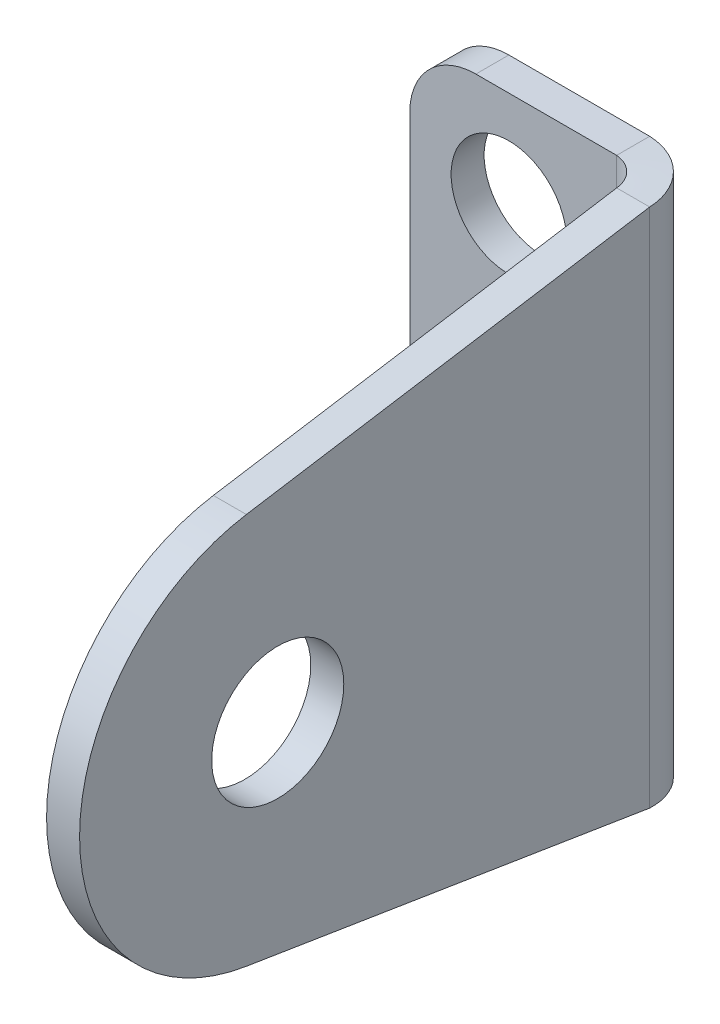
ISO-10303-21;
HEADER;
FILE_DESCRIPTION(('STEP AP214'),'2;1');
FILE_NAME('part.step','',(''),(''),'','','');
FILE_SCHEMA(('AUTOMOTIVE_DESIGN { 1 0 10303 214 1 1 1 1 }'));
ENDSEC;
DATA;
#1=APPLICATION_CONTEXT('core data for automotive mechanical design processes');
#2=APPLICATION_PROTOCOL_DEFINITION('international standard','automotive_design',2000,#1);
#3=PRODUCT_CONTEXT('',#1,'mechanical');
#4=PRODUCT('Part','Part','',(#3));
#5=PRODUCT_RELATED_PRODUCT_CATEGORY('part','',(#4));
#6=PRODUCT_DEFINITION_FORMATION('','',#4);
#7=PRODUCT_DEFINITION_CONTEXT('part definition',#1,'design');
#8=PRODUCT_DEFINITION('design','',#6,#7);
#9=PRODUCT_DEFINITION_SHAPE('','',#8);
#10=(LENGTH_UNIT() NAMED_UNIT(*) SI_UNIT(.MILLI.,.METRE.));
#11=(NAMED_UNIT(*) PLANE_ANGLE_UNIT() SI_UNIT($,.RADIAN.));
#12=(NAMED_UNIT(*) SI_UNIT($,.STERADIAN.) SOLID_ANGLE_UNIT());
#13=UNCERTAINTY_MEASURE_WITH_UNIT(LENGTH_MEASURE(1.E-05),#10,'distance_accuracy_value','');
#14=(GEOMETRIC_REPRESENTATION_CONTEXT(3) GLOBAL_UNCERTAINTY_ASSIGNED_CONTEXT((#13)) GLOBAL_UNIT_ASSIGNED_CONTEXT((#10,
#11,#12)) REPRESENTATION_CONTEXT('',''));
#15=CARTESIAN_POINT('',(0.,0.,0.));
#16=DIRECTION('',(0.,0.,1.));
#17=DIRECTION('',(1.,0.,0.));
#18=AXIS2_PLACEMENT_3D('',#15,#16,#17);
#19=CARTESIAN_POINT('',(0.,16.,-1.));
#20=DIRECTION('',(0.,1.,0.));
#21=DIRECTION('',(0.,0.,1.));
#22=AXIS2_PLACEMENT_3D('',#19,#20,#21);
#23=PLANE('',#22);
#24=DIRECTION('',(-1.,0.,0.));
#25=VECTOR('',#24,1.);
#26=CARTESIAN_POINT('',(0.,16.,-1.));
#27=LINE('',#26,#25);
#28=CARTESIAN_POINT('',(0.26340000000001,16.,-0.999999999999999));
#29=VERTEX_POINT('',#28);
#30=CARTESIAN_POINT('',(-3.99999999999999,16.,-1.));
#31=VERTEX_POINT('',#30);
#32=EDGE_CURVE('E253',#29,#31,#27,.T.);
#33=ORIENTED_EDGE('',*,*,#32,.T.);
#34=DIRECTION('',(0.,0.,1.));
#35=VECTOR('',#34,1.);
#36=CARTESIAN_POINT('',(-3.99999999999999,16.,-1.));
#37=LINE('',#36,#35);
#38=CARTESIAN_POINT('',(-3.99999999999999,16.,0.));
#39=VERTEX_POINT('',#38);
#40=EDGE_CURVE('E13',#31,#39,#37,.T.);
#41=ORIENTED_EDGE('',*,*,#40,.T.);
#42=DIRECTION('',(-1.,0.,0.));
#43=VECTOR('',#42,1.);
#44=CARTESIAN_POINT('',(0.,16.,0.));
#45=LINE('',#44,#43);
#46=CARTESIAN_POINT('',(0.263400000000009,16.,0.));
#47=VERTEX_POINT('',#46);
#48=EDGE_CURVE('E248',#47,#39,#45,.T.);
#49=ORIENTED_EDGE('',*,*,#48,.F.);
#50=DIRECTION('',(0.,0.,-1.));
#51=VECTOR('',#50,1.);
#52=CARTESIAN_POINT('',(0.263400000000009,16.,0.));
#53=LINE('',#52,#51);
#54=EDGE_CURVE('E236',#47,#29,#53,.T.);
#55=ORIENTED_EDGE('',*,*,#54,.T.);
#56=EDGE_LOOP('',(#33,#41,#49,#55));
#57=FACE_BOUND('',#56,.T.);
#58=ADVANCED_FACE('F55',(#57),#23,.T.);
#59=CARTESIAN_POINT('',(0.,0.,-1.));
#60=DIRECTION('',(0.,0.,-1.));
#61=DIRECTION('',(-1.,0.,0.));
#62=AXIS2_PLACEMENT_3D('',#59,#60,#61);
#63=PLANE('',#62);
#64=CARTESIAN_POINT('',(-2.99999999999999,3.,-1.));
#65=DIRECTION('',(0.,0.,1.));
#66=DIRECTION('',(1.,0.,0.));
#67=AXIS2_PLACEMENT_3D('',#64,#65,#66);
#68=CIRCLE('',#67,1.75);
#69=CARTESIAN_POINT('',(-1.24999999999999,3.,-1.));
#70=VERTEX_POINT('',#69);
#71=EDGE_CURVE('E239',#70,#70,#68,.T.);
#72=ORIENTED_EDGE('',*,*,#71,.T.);
#73=EDGE_LOOP('',(#72));
#74=FACE_BOUND('',#73,.T.);
#75=CARTESIAN_POINT('',(-2.99999999999999,13.,-1.));
#76=DIRECTION('',(0.,0.,1.));
#77=DIRECTION('',(1.,0.,0.));
#78=AXIS2_PLACEMENT_3D('',#75,#76,#77);
#79=CIRCLE('',#78,1.75);
#80=CARTESIAN_POINT('',(-1.24999999999999,13.,-1.));
#81=VERTEX_POINT('',#80);
#82=EDGE_CURVE('E245',#81,#81,#79,.T.);
#83=ORIENTED_EDGE('',*,*,#82,.T.);
#84=EDGE_LOOP('',(#83));
#85=FACE_BOUND('',#84,.T.);
#86=DIRECTION('',(1.,0.,0.));
#87=VECTOR('',#86,1.);
#88=CARTESIAN_POINT('',(2.00000000000001,0.,-1.));
#89=LINE('',#88,#87);
#90=CARTESIAN_POINT('',(-3.99999999999999,0.,-1.));
#91=VERTEX_POINT('',#90);
#92=CARTESIAN_POINT('',(0.263400000000012,0.,-1.));
#93=VERTEX_POINT('',#92);
#94=EDGE_CURVE('E251',#91,#93,#89,.T.);
#95=ORIENTED_EDGE('',*,*,#94,.F.);
#96=CARTESIAN_POINT('',(-3.99999999999999,2.,-1.));
#97=DIRECTION('',(0.,0.,-1.));
#98=DIRECTION('',(-1.,0.,0.));
#99=AXIS2_PLACEMENT_3D('',#96,#97,#98);
#100=CIRCLE('',#99,2.);
#101=CARTESIAN_POINT('',(-5.99999999999999,2.,-1.));
#102=VERTEX_POINT('',#101);
#103=EDGE_CURVE('E63',#91,#102,#100,.T.);
#104=ORIENTED_EDGE('',*,*,#103,.T.);
#105=DIRECTION('',(0.,-1.,0.));
#106=VECTOR('',#105,1.);
#107=CARTESIAN_POINT('',(-5.99999999999999,0.,-1.));
#108=LINE('',#107,#106);
#109=CARTESIAN_POINT('',(-5.99999999999999,14.,-1.));
#110=VERTEX_POINT('',#109);
#111=EDGE_CURVE('E256',#110,#102,#108,.T.);
#112=ORIENTED_EDGE('',*,*,#111,.F.);
#113=CARTESIAN_POINT('',(-3.99999999999999,14.,-1.));
#114=DIRECTION('',(0.,0.,-1.));
#115=DIRECTION('',(-1.,0.,0.));
#116=AXIS2_PLACEMENT_3D('',#113,#114,#115);
#117=CIRCLE('',#116,2.);
#118=EDGE_CURVE('E70',#110,#31,#117,.T.);
#119=ORIENTED_EDGE('',*,*,#118,.T.);
#120=ORIENTED_EDGE('',*,*,#32,.F.);
#121=DIRECTION('',(0.,1.,0.));
#122=VECTOR('',#121,1.);
#123=CARTESIAN_POINT('',(0.26340000000001,16.,-0.999999999999999));
#124=LINE('',#123,#122);
#125=EDGE_CURVE('E192',#29,#93,#124,.F.);
#126=ORIENTED_EDGE('',*,*,#125,.T.);
#127=EDGE_LOOP('',(#95,#104,#112,#119,#120,#126));
#128=FACE_BOUND('',#127,.T.);
#129=ADVANCED_FACE('F276',(#74,#85,#128),#63,.T.);
#130=CARTESIAN_POINT('',(0.,0.,0.));
#131=DIRECTION('',(0.,0.,-1.));
#132=DIRECTION('',(-1.,0.,0.));
#133=AXIS2_PLACEMENT_3D('',#130,#131,#132);
#134=PLANE('',#133);
#135=CARTESIAN_POINT('',(-2.99999999999999,13.,0.));
#136=DIRECTION('',(0.,0.,1.));
#137=DIRECTION('',(1.,0.,0.));
#138=AXIS2_PLACEMENT_3D('',#135,#136,#137);
#139=CIRCLE('',#138,1.75);
#140=CARTESIAN_POINT('',(-1.24999999999999,13.,0.));
#141=VERTEX_POINT('',#140);
#142=EDGE_CURVE('E242',#141,#141,#139,.T.);
#143=ORIENTED_EDGE('',*,*,#142,.F.);
#144=EDGE_LOOP('',(#143));
#145=FACE_BOUND('',#144,.T.);
#146=CARTESIAN_POINT('',(-2.99999999999999,3.,0.));
#147=DIRECTION('',(0.,0.,1.));
#148=DIRECTION('',(1.,0.,0.));
#149=AXIS2_PLACEMENT_3D('',#146,#147,#148);
#150=CIRCLE('',#149,1.75);
#151=CARTESIAN_POINT('',(-1.24999999999999,3.,0.));
#152=VERTEX_POINT('',#151);
#153=EDGE_CURVE('E235',#152,#152,#150,.T.);
#154=ORIENTED_EDGE('',*,*,#153,.F.);
#155=EDGE_LOOP('',(#154));
#156=FACE_BOUND('',#155,.T.);
#157=DIRECTION('',(0.,-1.,0.));
#158=VECTOR('',#157,1.);
#159=CARTESIAN_POINT('',(-5.99999999999999,0.,0.));
#160=LINE('',#159,#158);
#161=CARTESIAN_POINT('',(-5.99999999999999,14.,0.));
#162=VERTEX_POINT('',#161);
#163=CARTESIAN_POINT('',(-5.99999999999999,2.,0.));
#164=VERTEX_POINT('',#163);
#165=EDGE_CURVE('E262',#162,#164,#160,.T.);
#166=ORIENTED_EDGE('',*,*,#165,.T.);
#167=CARTESIAN_POINT('',(-3.99999999999999,2.,0.));
#168=DIRECTION('',(0.,0.,-1.));
#169=DIRECTION('',(-1.,0.,0.));
#170=AXIS2_PLACEMENT_3D('',#167,#168,#169);
#171=CIRCLE('',#170,2.);
#172=CARTESIAN_POINT('',(-3.99999999999999,0.,0.));
#173=VERTEX_POINT('',#172);
#174=EDGE_CURVE('E272',#164,#173,#171,.F.);
#175=ORIENTED_EDGE('',*,*,#174,.T.);
#176=DIRECTION('',(1.,0.,0.));
#177=VECTOR('',#176,1.);
#178=CARTESIAN_POINT('',(0.,0.,0.));
#179=LINE('',#178,#177);
#180=CARTESIAN_POINT('',(0.263400000000012,0.,0.));
#181=VERTEX_POINT('',#180);
#182=EDGE_CURVE('E254',#173,#181,#179,.T.);
#183=ORIENTED_EDGE('',*,*,#182,.T.);
#184=DIRECTION('',(0.,1.,0.));
#185=VECTOR('',#184,1.);
#186=CARTESIAN_POINT('',(0.263400000000009,16.,0.));
#187=LINE('',#186,#185);
#188=EDGE_CURVE('E182',#47,#181,#187,.F.);
#189=ORIENTED_EDGE('',*,*,#188,.F.);
#190=ORIENTED_EDGE('',*,*,#48,.T.);
#191=CARTESIAN_POINT('',(-3.99999999999999,14.,0.));
#192=DIRECTION('',(0.,0.,-1.));
#193=DIRECTION('',(-1.,0.,0.));
#194=AXIS2_PLACEMENT_3D('',#191,#192,#193);
#195=CIRCLE('',#194,2.);
#196=EDGE_CURVE('E270',#39,#162,#195,.F.);
#197=ORIENTED_EDGE('',*,*,#196,.T.);
#198=EDGE_LOOP('',(#166,#175,#183,#189,#190,#197));
#199=FACE_BOUND('',#198,.T.);
#200=ADVANCED_FACE('F286',(#145,#156,#199),#134,.F.);
#201=CARTESIAN_POINT('',(0.,0.,-1.));
#202=DIRECTION('',(0.,-1.,0.));
#203=DIRECTION('',(1.,0.,0.));
#204=AXIS2_PLACEMENT_3D('',#201,#202,#203);
#205=PLANE('',#204);
#206=ORIENTED_EDGE('',*,*,#182,.F.);
#207=DIRECTION('',(0.,0.,1.));
#208=VECTOR('',#207,1.);
#209=CARTESIAN_POINT('',(-3.99999999999999,0.,-1.));
#210=LINE('',#209,#208);
#211=EDGE_CURVE('E78',#173,#91,#210,.F.);
#212=ORIENTED_EDGE('',*,*,#211,.T.);
#213=ORIENTED_EDGE('',*,*,#94,.T.);
#214=DIRECTION('',(0.,0.,-1.));
#215=VECTOR('',#214,1.);
#216=CARTESIAN_POINT('',(0.263400000000012,0.,0.));
#217=LINE('',#216,#215);
#218=EDGE_CURVE('E227',#181,#93,#217,.T.);
#219=ORIENTED_EDGE('',*,*,#218,.F.);
#220=EDGE_LOOP('',(#206,#212,#213,#219));
#221=FACE_BOUND('',#220,.T.);
#222=ADVANCED_FACE('F289',(#221),#205,.T.);
#223=CARTESIAN_POINT('',(-5.99999999999999,0.,-1.));
#224=DIRECTION('',(-1.,0.,0.));
#225=DIRECTION('',(0.,-1.,0.));
#226=AXIS2_PLACEMENT_3D('',#223,#224,#225);
#227=PLANE('',#226);
#228=ORIENTED_EDGE('',*,*,#111,.T.);
#229=DIRECTION('',(0.,0.,1.));
#230=VECTOR('',#229,1.);
#231=CARTESIAN_POINT('',(-5.99999999999999,2.,-1.));
#232=LINE('',#231,#230);
#233=EDGE_CURVE('E267',#102,#164,#232,.T.);
#234=ORIENTED_EDGE('',*,*,#233,.T.);
#235=ORIENTED_EDGE('',*,*,#165,.F.);
#236=DIRECTION('',(0.,0.,1.));
#237=VECTOR('',#236,1.);
#238=CARTESIAN_POINT('',(-5.99999999999999,14.,-1.));
#239=LINE('',#238,#237);
#240=EDGE_CURVE('E259',#162,#110,#239,.F.);
#241=ORIENTED_EDGE('',*,*,#240,.T.);
#242=EDGE_LOOP('',(#228,#234,#235,#241));
#243=FACE_BOUND('',#242,.T.);
#244=ADVANCED_FACE('F281',(#243),#227,.T.);
#245=CARTESIAN_POINT('',(-2.99999999999999,13.,-1.));
#246=DIRECTION('',(0.,0.,1.));
#247=DIRECTION('',(1.,0.,0.));
#248=AXIS2_PLACEMENT_3D('',#245,#246,#247);
#249=CYLINDRICAL_SURFACE('',#248,1.75);
#250=ORIENTED_EDGE('',*,*,#82,.F.);
#251=EDGE_LOOP('',(#250));
#252=FACE_BOUND('',#251,.T.);
#253=ORIENTED_EDGE('',*,*,#142,.T.);
#254=EDGE_LOOP('',(#253));
#255=FACE_BOUND('',#254,.T.);
#256=ADVANCED_FACE('F407',(#252,#255),#249,.F.);
#257=CARTESIAN_POINT('',(-2.99999999999999,3.,-1.));
#258=DIRECTION('',(0.,0.,1.));
#259=DIRECTION('',(1.,0.,0.));
#260=AXIS2_PLACEMENT_3D('',#257,#258,#259);
#261=CYLINDRICAL_SURFACE('',#260,1.75);
#262=ORIENTED_EDGE('',*,*,#71,.F.);
#263=EDGE_LOOP('',(#262));
#264=FACE_BOUND('',#263,.T.);
#265=ORIENTED_EDGE('',*,*,#153,.T.);
#266=EDGE_LOOP('',(#265));
#267=FACE_BOUND('',#266,.T.);
#268=ADVANCED_FACE('F397',(#264,#267),#261,.F.);
#269=CARTESIAN_POINT('',(0.263400000000009,0.,-1.01));
#270=CARTESIAN_POINT('',(0.492070551015172,0.00984057428855146,-1.01));
#271=CARTESIAN_POINT('',(0.720568854821927,0.0196776070925714,-0.96454067706888));
#272=CARTESIAN_POINT('',(1.14302091111582,0.0393552141851417,-0.789555305899548));
#273=CARTESIAN_POINT('',(1.33676730110819,0.0491940177314247,-0.660098106932663));
#274=CARTESIAN_POINT('',(1.66009810693267,0.0688716248239946,-0.336767301108189));
#275=CARTESIAN_POINT('',(1.78955530589956,0.0787104283702811,-0.143020911115817));
#276=CARTESIAN_POINT('',(1.96454067706889,0.0983880354628514,0.279431145178076));
#277=CARTESIAN_POINT('',(2.01000000000001,0.108225068266871,0.507929448984831));
#278=CARTESIAN_POINT('',(2.01000000000001,0.118065642555423,0.736599999999994));
#279=CARTESIAN_POINT('',(0.263400000000009,0.,-0.999999999999999));
#280=CARTESIAN_POINT('',(0.490761317042484,0.00984057413891977,-0.999999999999999));
#281=CARTESIAN_POINT('',(0.717951375978334,0.0196776070925714,-0.954800950302197));
#282=CARTESIAN_POINT('',(1.13798472131211,0.0393552141851417,-0.780817442016005));
#283=CARTESIAN_POINT('',(1.33062183390845,0.0491940177314247,-0.652101438508681));
#284=CARTESIAN_POINT('',(1.65210143850869,0.0688716248239946,-0.33062183390844));
#285=CARTESIAN_POINT('',(1.78081744201601,0.0787104283702811,-0.137984721312108));
#286=CARTESIAN_POINT('',(1.95480095030221,0.0983880354628514,0.282048624021669));
#287=CARTESIAN_POINT('',(2.00000000000001,0.108225068416503,0.509238682957519));
#288=CARTESIAN_POINT('',(2.00000000000001,0.118065642555423,0.736599999999994));
#289=CARTESIAN_POINT('',(0.26340000000001,0.,0.));
#290=CARTESIAN_POINT('',(0.359837919773669,0.00984055917575046,0.));
#291=CARTESIAN_POINT('',(0.456203491619056,0.0196776070925714,0.0191717263661192));
#292=CARTESIAN_POINT('',(0.634365740941214,0.0393552141851417,0.0929689463382536));
#293=CARTESIAN_POINT('',(0.716075113933532,0.0491940177314247,0.1475654038895));
#294=CARTESIAN_POINT('',(0.852434596110509,0.0688716248239946,0.283924886066477));
#295=CARTESIAN_POINT('',(0.907031053661756,0.0787104283702811,0.365634259058794));
#296=CARTESIAN_POINT('',(0.980828273633891,0.0983880354628514,0.543796508380952));
#297=CARTESIAN_POINT('',(1.00000000000001,0.108225083379672,0.640162080226339));
#298=CARTESIAN_POINT('',(1.00000000000001,0.118065642555423,0.736599999999997));
#299=CARTESIAN_POINT('',(0.26340000000001,0.,0.0101000000000008));
#300=CARTESIAN_POINT('',(0.358515593461254,0.00984055902462245,0.0101000000000006));
#301=CARTESIAN_POINT('',(0.453559837987027,0.0196776070925714,0.0290088504004692));
#302=CARTESIAN_POINT('',(0.629279189239468,0.0393552141851417,0.101794188860632));
#303=CARTESIAN_POINT('',(0.709868192061785,0.0491940177314247,0.155642038997722));
#304=CARTESIAN_POINT('',(0.844357961002287,0.0688716248239946,0.290131807938223));
#305=CARTESIAN_POINT('',(0.898205811139378,0.0787104283702811,0.37072081076054));
#306=CARTESIAN_POINT('',(0.970991149599541,0.0983880354628514,0.546440162012981));
#307=CARTESIAN_POINT('',(0.98990000000001,0.1082250835308,0.641484406538754));
#308=CARTESIAN_POINT('',(0.989900000000011,0.118065642555423,0.736599999999997));
#309=B_SPLINE_SURFACE_WITH_KNOTS('',1,3,((#269,#270,#271,#272,#273,#274,#275,#276,#277,#278),
(#279,#280,#281,#282,#283,#284,#285,#286,#287,#288),(#289,#290,#291,#292,#293,#294,#295,#296,
#297,#298),(#299,#300,#301,#302,#303,#304,#305,#306,#307,#308)),.UNSPECIFIED.,.F.,.F.,.F.,(2,1,
1,2),(4,2,2,2,4),(-0.01,0.,1.,1.0101),(0.,0.25,0.5,0.75,1.),.UNSPECIFIED.);
#310=DIRECTION('',(-1.,0.,0.));
#311=VECTOR('',#310,1.);
#312=CARTESIAN_POINT('',(2.00000000000001,0.118065642555422,0.736599999999994));
#313=LINE('',#312,#311);
#314=CARTESIAN_POINT('',(1.00000000000001,0.118065642555423,0.736599999999997));
#315=VERTEX_POINT('',#314);
#316=CARTESIAN_POINT('',(2.00000000000001,0.118065642555423,0.736599999999994));
#317=VERTEX_POINT('',#316);
#318=EDGE_CURVE('E159',#315,#317,#313,.F.);
#319=CARTESIAN_POINT('',(0.26340000000001,0.,0.));
#320=CARTESIAN_POINT('',(0.275452601486982,0.0012298504432876,-2.55665591045213E-07));
#321=CARTESIAN_POINT('',(0.287505181219317,0.00245970088657306,0.00029580594561314));
#322=CARTESIAN_POINT('',(0.311581316599855,0.0049194017731428,0.00147872797292814));
#323=CARTESIAN_POINT('',(0.323604872248058,0.0061492522164271,0.00236558838903895));
#324=CARTESIAN_POINT('',(0.347593978885471,0.00860895310299769,0.00472827227748186));
#325=CARTESIAN_POINT('',(0.359559529874681,0.00983880354628399,0.00620409574981395));
#326=CARTESIAN_POINT('',(0.383403805092978,0.0122985044328567,0.0097410697700719));
#327=CARTESIAN_POINT('',(0.395282529322065,0.0135283548761431,0.0118022203179977));
#328=CARTESIAN_POINT('',(0.418924533072115,0.0159880557627134,0.0165049045919641));
#329=CARTESIAN_POINT('',(0.430687812593077,0.0172179062059975,0.0191464383180047));
#330=CARTESIAN_POINT('',(0.454070588440431,0.019677607092568,0.0250035194757939));
#331=CARTESIAN_POINT('',(0.465690084766823,0.0209074575358545,0.0282190669075426));
#332=CARTESIAN_POINT('',(0.488757301764471,0.0233671584224268,0.035216430491768));
#333=CARTESIAN_POINT('',(0.500205022435727,0.0245970088657125,0.0389982466442447));
#334=CARTESIAN_POINT('',(0.522901109581712,0.0270567097522847,0.0471190365281297));
#335=CARTESIAN_POINT('',(0.534149476056442,0.0282865601955712,0.0514580102595381));
#336=CARTESIAN_POINT('',(0.556419756503828,0.0307462610821418,0.0606826624448346));
#337=CARTESIAN_POINT('',(0.567441670476485,0.0319761115254257,0.0655683408987227));
#338=CARTESIAN_POINT('',(0.589232493165026,0.0344358124119962,0.0758746324718209));
#339=CARTESIAN_POINT('',(0.60000140188091,0.0356656628552827,0.0812952455910311));
#340=CARTESIAN_POINT('',(0.62126027081117,0.0381253637418551,0.0926583477709722));
#341=CARTESIAN_POINT('',(0.631750231025546,0.039355214185141,0.0986008368317031));
#342=CARTESIAN_POINT('',(0.652425931719928,0.0418149150717127,0.110993374915896));
#343=CARTESIAN_POINT('',(0.662611672199933,0.0430447655149986,0.117443423939358));
#344=CARTESIAN_POINT('',(0.682654395084564,0.0455044664015709,0.130835543216532));
#345=CARTESIAN_POINT('',(0.692511377489189,0.0467343168448573,0.137777613470244));
#346=CARTESIAN_POINT('',(0.711872837889083,0.0491940177314281,0.152137051152469));
#347=CARTESIAN_POINT('',(0.721377315884353,0.0504238681747127,0.159554418580983));
#348=CARTESIAN_POINT('',(0.740010870345549,0.0528835690612817,0.174846581525032));
#349=CARTESIAN_POINT('',(0.749139946811476,0.0541134195045662,0.182721377040568));
#350=CARTESIAN_POINT('',(0.76700070546917,0.0565731203911371,0.198909425086505));
#351=CARTESIAN_POINT('',(0.775732387660937,0.0578029708344234,0.207222677616905));
#352=CARTESIAN_POINT('',(0.792777322383104,0.0602626717209957,0.224267612339072));
#353=CARTESIAN_POINT('',(0.801090574913504,0.0614925221642815,0.232999294530839));
#354=CARTESIAN_POINT('',(0.817278622959441,0.0639522230508534,0.250860053188532));
#355=CARTESIAN_POINT('',(0.825153418474977,0.0651820734941395,0.25998912965446));
#356=CARTESIAN_POINT('',(0.840445581419026,0.0676417743807114,0.278622684115656));
#357=CARTESIAN_POINT('',(0.84786294884754,0.0688716248239972,0.288127162110925));
#358=CARTESIAN_POINT('',(0.862222386529765,0.0713313257105695,0.30748862251082));
#359=CARTESIAN_POINT('',(0.869164456783477,0.0725611761538558,0.317345604915445));
#360=CARTESIAN_POINT('',(0.882556576060652,0.0750208770404267,0.337388327800075));
#361=CARTESIAN_POINT('',(0.889006625084114,0.0762507274837112,0.347574068280081));
#362=CARTESIAN_POINT('',(0.901399163168307,0.0787104283702803,0.368249768974462));
#363=CARTESIAN_POINT('',(0.907341652229038,0.0799402788135648,0.378739729188839));
#364=CARTESIAN_POINT('',(0.918704754408979,0.0823999797001357,0.399998598119099));
#365=CARTESIAN_POINT('',(0.924125367528189,0.083629830143422,0.410767506834982));
#366=CARTESIAN_POINT('',(0.934431659101287,0.0860895310299943,0.432558329523523));
#367=CARTESIAN_POINT('',(0.939317337555175,0.0873193814732802,0.44358024349618));
#368=CARTESIAN_POINT('',(0.948541989740472,0.089779082359852,0.465850523943566));
#369=CARTESIAN_POINT('',(0.95288096347188,0.0910089328031378,0.477098890418296));
#370=CARTESIAN_POINT('',(0.961001753355766,0.0934686336897102,0.499794977564281));
#371=CARTESIAN_POINT('',(0.964783569508242,0.0946984841329967,0.511242698235537));
#372=CARTESIAN_POINT('',(0.971780933092468,0.0971581850195672,0.534309915233185));
#373=CARTESIAN_POINT('',(0.974996480524217,0.0983880354628512,0.545929411559577));
#374=CARTESIAN_POINT('',(0.980853561682006,0.100847736349422,0.569312187406931));
#375=CARTESIAN_POINT('',(0.983495095408046,0.102077586792708,0.581075466927893));
#376=CARTESIAN_POINT('',(0.988197779682013,0.104537287679281,0.604717470677942));
#377=CARTESIAN_POINT('',(0.990258930229939,0.105767138122567,0.61659619490703));
#378=CARTESIAN_POINT('',(0.993795904250197,0.108226839009137,0.640440470125327));
#379=CARTESIAN_POINT('',(0.995271727722529,0.109456689452422,0.652406021114537));
#380=CARTESIAN_POINT('',(0.997634411610972,0.111916390338992,0.67639512775195));
#381=CARTESIAN_POINT('',(0.998521272027083,0.113146240782278,0.688418683400152));
#382=CARTESIAN_POINT('',(0.999704194054398,0.115605941668851,0.71249481878069));
#383=CARTESIAN_POINT('',(1.0000002556656,0.116835792112137,0.724547398513026));
#384=CARTESIAN_POINT('',(1.00000000000001,0.118065642555423,0.736599999999997));
#385=B_SPLINE_CURVE_WITH_KNOTS('',3,(#319,#320,#321,#322,#323,#324,#325,#326,#327,#328,#329,
#330,#331,#332,#333,#334,#335,#336,#337,#338,#339,#340,#341,#342,#343,#344,#345,#346,#347,#348,
#349,#350,#351,#352,#353,#354,#355,#356,#357,#358,#359,#360,#361,#362,#363,#364,#365,#366,#367,
#368,#369,#370,#371,#372,#373,#374,#375,#376,#377,#378,#379,#380,#381,#382,#383,#384),
.UNSPECIFIED.,.F.,.F.,(4,2,2,2,2,2,2,2,2,2,2,2,2,2,2,2,2,2,2,2,2,2,2,2,2,2,2,2,2,2,2,2,4),(0.,
0.0363419107011757,0.0726838214023513,0.109025732103527,0.145367642804703,0.181709553505878,
0.218051464207054,0.25439337490823,0.290735285609406,0.327077196310581,0.363419107011757,
0.399761017712933,0.436102928414109,0.472444839115284,0.50878674981646,0.545128660517635,
0.581470571218811,0.617812481919987,0.654154392621163,0.690496303322339,0.726838214023514,
0.76318012472469,0.799522035425865,0.835863946127041,0.872205856828217,0.908547767529393,
0.944889678230569,0.981231588931744,1.01757349963292,1.0539154103341,1.09025732103527,
1.12659923173645,1.16294114243762),.UNSPECIFIED.);
#386=EDGE_CURVE('E185',#181,#315,#385,.T.);
#387=CARTESIAN_POINT('',(0.263400000000009,0.,-0.999999999999999));
#388=CARTESIAN_POINT('',(0.291815079747871,0.00122985044328761,-1.00000060275437));
#389=CARTESIAN_POINT('',(0.320230108207243,0.00245970088657306,-0.99930261117954));
#390=CARTESIAN_POINT('',(0.376991738266763,0.00491940177314281,-0.996513767312264));
#391=CARTESIAN_POINT('',(0.405338339866911,0.0061492522164271,-0.994422915019815));
#392=CARTESIAN_POINT('',(0.461894791925737,0.00860895310299769,-0.988852677658059));
#393=CARTESIAN_POINT('',(0.490104642384415,0.00983880354628399,-0.985373292588751));
#394=CARTESIAN_POINT('',(0.546319641493965,0.0122985044328567,-0.977034561820926));
#395=CARTESIAN_POINT('',(0.574324790144838,0.0135283548761431,-0.972175216122408));
#396=CARTESIAN_POINT('',(0.630062916281596,0.0159880557627134,-0.961088219774092));
#397=CARTESIAN_POINT('',(0.657795893767481,0.0172179062059975,-0.954860569124292));
#398=CARTESIAN_POINT('',(0.712922867072552,0.019677607092568,-0.941051979470998));
#399=CARTESIAN_POINT('',(0.740316862891738,0.0209074575358545,-0.933471040467502));
#400=CARTESIAN_POINT('',(0.794699878148478,0.0233671584224268,-0.916974133597606));
#401=CARTESIAN_POINT('',(0.821688897586032,0.0245970088657125,-0.908058165731205));
#402=CARTESIAN_POINT('',(0.875196941215843,0.0270567097522847,-0.888912681462464));
#403=CARTESIAN_POINT('',(0.901715965408099,0.0282865601955713,-0.878683165060123));
#404=CARTESIAN_POINT('',(0.954220131882348,0.0307462610821418,-0.856935227258079));
#405=CARTESIAN_POINT('',(0.980205274164341,0.0319761115254257,-0.845416805858375));
#406=CARTESIAN_POINT('',(1.03157907633773,0.0344358124119962,-0.82111880701797));
#407=CARTESIAN_POINT('',(1.05696773622913,0.0356656628552827,-0.808339229577269));
#408=CARTESIAN_POINT('',(1.10708741011494,0.0381253637418551,-0.78154970575744));
#409=CARTESIAN_POINT('',(1.13181842410936,0.039355214185141,-0.767539759378313));
#410=CARTESIAN_POINT('',(1.18056322702256,0.0418149150717127,-0.738323248874634));
#411=CARTESIAN_POINT('',(1.20457701594134,0.0430447655149986,-0.723116684750084));
#412=CARTESIAN_POINT('',(1.25182951738236,0.0455044664015709,-0.691543572699119));
#413=CARTESIAN_POINT('',(1.27506822990458,0.0467343168448573,-0.675177024772706));
#414=CARTESIAN_POINT('',(1.32071459445855,0.0491940177314281,-0.641323373565874));
#415=CARTESIAN_POINT('',(1.3431222464903,0.0504238681747127,-0.623836270285455));
#416=CARTESIAN_POINT('',(1.38705250806689,0.0528835690612817,-0.587783636334007));
#417=CARTESIAN_POINT('',(1.40857511761173,0.0541134195045662,-0.569218105662978));
#418=CARTESIAN_POINT('',(1.45068344436295,0.0565731203911371,-0.53105334291987));
#419=CARTESIAN_POINT('',(1.47126916156934,0.0578029708344234,-0.511454110847792));
#420=CARTESIAN_POINT('',(1.5114541108478,0.0602626717209957,-0.47126916156933));
#421=CARTESIAN_POINT('',(1.53105334291988,0.0614925221642815,-0.450683444362946));
#422=CARTESIAN_POINT('',(1.56921810566298,0.0639522230508534,-0.408575117611723));
#423=CARTESIAN_POINT('',(1.58778363633401,0.0651820734941395,-0.387052508066883));
#424=CARTESIAN_POINT('',(1.62383627028546,0.0676417743807114,-0.343122246490296));
#425=CARTESIAN_POINT('',(1.64132337356588,0.0688716248239972,-0.320714594458549));
#426=CARTESIAN_POINT('',(1.67517702477271,0.0713313257105695,-0.275068229904576));
#427=CARTESIAN_POINT('',(1.69154357269913,0.0725611761538558,-0.251829517382351));
#428=CARTESIAN_POINT('',(1.72311668475009,0.0750208770404267,-0.204577015941339));
#429=CARTESIAN_POINT('',(1.73832324887464,0.0762507274837112,-0.180563227022553));
#430=CARTESIAN_POINT('',(1.76753975937832,0.0787104283702803,-0.131818424109352));
#431=CARTESIAN_POINT('',(1.78154970575745,0.0799402788135648,-0.107087410114938));
#432=CARTESIAN_POINT('',(1.80833922957728,0.0823999797001357,-0.0569677362291253));
#433=CARTESIAN_POINT('',(1.82111880701798,0.083629830143422,-0.0315790763377276));
#434=CARTESIAN_POINT('',(1.84541680585838,0.0860895310299943,0.0197947258356631));
#435=CARTESIAN_POINT('',(1.85693522725809,0.0873193814732802,0.0457798681176561));
#436=CARTESIAN_POINT('',(1.87868316506013,0.089779082359852,0.0982840345919049));
#437=CARTESIAN_POINT('',(1.88891268146247,0.0910089328031378,0.124803058784161));
#438=CARTESIAN_POINT('',(1.90805816573121,0.0934686336897102,0.178311102413971));
#439=CARTESIAN_POINT('',(1.91697413359761,0.0946984841329967,0.205300121851526));
#440=CARTESIAN_POINT('',(1.93347104046751,0.0971581850195672,0.259683137108266));
#441=CARTESIAN_POINT('',(1.94105197947101,0.0983880354628512,0.287077132927451));
#442=CARTESIAN_POINT('',(1.9548605691243,0.100847736349422,0.342204106232522));
#443=CARTESIAN_POINT('',(1.9610882197741,0.102077586792708,0.369937083718407));
#444=CARTESIAN_POINT('',(1.97217521612242,0.104537287679281,0.425675209855165));
#445=CARTESIAN_POINT('',(1.97703456182094,0.105767138122567,0.453680358506038));
#446=CARTESIAN_POINT('',(1.98537329258876,0.108226839009137,0.509895357615588));
#447=CARTESIAN_POINT('',(1.98885267765807,0.109456689452422,0.538105208074266));
#448=CARTESIAN_POINT('',(1.99442291501983,0.111916390338992,0.594661660133092));
#449=CARTESIAN_POINT('',(1.99651376731228,0.113146240782278,0.62300826173324));
#450=CARTESIAN_POINT('',(1.99930261117955,0.115605941668851,0.67976989179276));
#451=CARTESIAN_POINT('',(2.00000060275438,0.116835792112137,0.708184920252132));
#452=CARTESIAN_POINT('',(2.00000000000001,0.118065642555423,0.736599999999994));
#453=B_SPLINE_CURVE_WITH_KNOTS('',3,(#387,#388,#389,#390,#391,#392,#393,#394,#395,#396,#397,
#398,#399,#400,#401,#402,#403,#404,#405,#406,#407,#408,#409,#410,#411,#412,#413,#414,#415,#416,
#417,#418,#419,#420,#421,#422,#423,#424,#425,#426,#427,#428,#429,#430,#431,#432,#433,#434,#435,
#436,#437,#438,#439,#440,#441,#442,#443,#444,#445,#446,#447,#448,#449,#450,#451,#452),
.UNSPECIFIED.,.F.,.F.,(4,2,2,2,2,2,2,2,2,2,2,2,2,2,2,2,2,2,2,2,2,2,2,2,2,2,2,2,2,2,2,2,4),(0.,
0.0853164104973215,0.170632820994643,0.255949231491965,0.341265641989286,0.426582052486608,
0.51189846298393,0.597214873481251,0.682531283978573,0.767847694475894,0.853164104973216,
0.938480515470537,1.02379692596786,1.10911333646518,1.1944297469625,1.27974615745982,
1.36506256795715,1.45037897845447,1.53569538895179,1.62101179944911,1.70632820994643,
1.79164462044375,1.87696103094107,1.9622774414384,2.04759385193572,2.13291026243304,
2.21822667293036,2.30354308342768,2.388859493925,2.47417590442233,2.55949231491965,
2.64480872541697,2.73012513591429),.UNSPECIFIED.);
#454=EDGE_CURVE('E217',#93,#317,#453,.T.);
#455=ORIENTED_EDGE('',*,*,#318,.F.);
#456=ORIENTED_EDGE('',*,*,#386,.F.);
#457=ORIENTED_EDGE('',*,*,#218,.T.);
#458=ORIENTED_EDGE('',*,*,#454,.T.);
#459=EDGE_LOOP('',(#455,#456,#457,#458));
#460=FACE_BOUND('',#459,.T.);
#461=ADVANCED_FACE('F208',(#460),#309,.F.);
#462=CARTESIAN_POINT('',(2.01000000000001,15.8819343574446,0.736599999999992));
#463=CARTESIAN_POINT('',(2.01000000000001,15.8917749317331,0.507929448984829));
#464=CARTESIAN_POINT('',(1.96454067706889,15.9016119645371,0.279431145178075));
#465=CARTESIAN_POINT('',(1.78955530589955,15.9212895716297,-0.143020911115817));
#466=CARTESIAN_POINT('',(1.66009810693267,15.931128375176,-0.336767301108189));
#467=CARTESIAN_POINT('',(1.33676730110819,15.9508059822686,-0.660098106932662));
#468=CARTESIAN_POINT('',(1.14302091111582,15.9606447858149,-0.789555305899547));
#469=CARTESIAN_POINT('',(0.720568854821927,15.9803223929074,-0.964540677068879));
#470=CARTESIAN_POINT('',(0.492070551015172,15.9901594257114,-1.01));
#471=CARTESIAN_POINT('',(0.26340000000001,16.,-1.01));
#472=CARTESIAN_POINT('',(2.00000000000001,15.8819343574446,0.736599999999992));
#473=CARTESIAN_POINT('',(2.00000000000001,15.8917749315835,0.509238682957517));
#474=CARTESIAN_POINT('',(1.9548009503022,15.9016119645371,0.282048624021668));
#475=CARTESIAN_POINT('',(1.78081744201601,15.9212895716297,-0.137984721312108));
#476=CARTESIAN_POINT('',(1.65210143850868,15.931128375176,-0.33062183390844));
#477=CARTESIAN_POINT('',(1.33062183390844,15.9508059822686,-0.65210143850868));
#478=CARTESIAN_POINT('',(1.13798472131211,15.9606447858149,-0.780817442016004));
#479=CARTESIAN_POINT('',(0.717951375978334,15.9803223929074,-0.954800950302196));
#480=CARTESIAN_POINT('',(0.490761317042484,15.9901594258611,-0.999999999999999));
#481=CARTESIAN_POINT('',(0.26340000000001,16.,-0.999999999999999));
#482=CARTESIAN_POINT('',(1.00000000000001,15.8819343574446,0.736599999999997));
#483=CARTESIAN_POINT('',(1.00000000000001,15.8917749166203,0.640162080226338));
#484=CARTESIAN_POINT('',(0.980828273633888,15.9016119645371,0.543796508380952));
#485=CARTESIAN_POINT('',(0.907031053661753,15.9212895716297,0.365634259058794));
#486=CARTESIAN_POINT('',(0.852434596110506,15.931128375176,0.283924886066477));
#487=CARTESIAN_POINT('',(0.716075113933529,15.9508059822686,0.147565403889501));
#488=CARTESIAN_POINT('',(0.634365740941211,15.9606447858149,0.0929689463382541));
#489=CARTESIAN_POINT('',(0.456203491619053,15.9803223929074,0.0191717263661196));
#490=CARTESIAN_POINT('',(0.359837919773666,15.9901594408242,0.));
#491=CARTESIAN_POINT('',(0.263400000000009,16.,0.));
#492=CARTESIAN_POINT('',(0.989900000000007,15.8819343574446,0.736599999999997));
#493=CARTESIAN_POINT('',(0.989900000000007,15.8917749164692,0.641484406538753));
#494=CARTESIAN_POINT('',(0.970991149599538,15.9016119645371,0.546440162012981));
#495=CARTESIAN_POINT('',(0.898205811139375,15.9212895716297,0.37072081076054));
#496=CARTESIAN_POINT('',(0.844357961002284,15.931128375176,0.290131807938224));
#497=CARTESIAN_POINT('',(0.709868192061783,15.9508059822686,0.155642038997722));
#498=CARTESIAN_POINT('',(0.629279189239465,15.9606447858149,0.101794188860632));
#499=CARTESIAN_POINT('',(0.453559837987025,15.9803223929074,0.0290088504004696));
#500=CARTESIAN_POINT('',(0.358515593461251,15.9901594409754,0.0101000000000009));
#501=CARTESIAN_POINT('',(0.263400000000009,16.,0.0101000000000008));
#502=B_SPLINE_SURFACE_WITH_KNOTS('',1,3,((#462,#463,#464,#465,#466,#467,#468,#469,#470,#471),
(#472,#473,#474,#475,#476,#477,#478,#479,#480,#481),(#482,#483,#484,#485,#486,#487,#488,#489,
#490,#491),(#492,#493,#494,#495,#496,#497,#498,#499,#500,#501)),.UNSPECIFIED.,.F.,.F.,.F.,(2,1,
1,2),(4,2,2,2,4),(-0.01,0.,1.,1.0101),(0.,0.25,0.5,0.75,1.),.UNSPECIFIED.);
#503=CARTESIAN_POINT('',(1.00000000000001,15.8819343574446,0.736599999999997));
#504=CARTESIAN_POINT('',(1.0000002556656,15.8831642078879,0.724547398513025));
#505=CARTESIAN_POINT('',(0.999704194054394,15.8843940583311,0.71249481878069));
#506=CARTESIAN_POINT('',(0.99852127202708,15.8868537592177,0.688418683400152));
#507=CARTESIAN_POINT('',(0.997634411610969,15.888083609661,0.676395127751949));
#508=CARTESIAN_POINT('',(0.995271727722526,15.8905433105476,0.652406021114536));
#509=CARTESIAN_POINT('',(0.993795904250194,15.8917731609909,0.640440470125326));
#510=CARTESIAN_POINT('',(0.990258930229935,15.8942328618774,0.616596194907029));
#511=CARTESIAN_POINT('',(0.988197779682009,15.8954627123207,0.604717470677942));
#512=CARTESIAN_POINT('',(0.983495095408043,15.8979224132073,0.581075466927893));
#513=CARTESIAN_POINT('',(0.980853561682002,15.8991522636506,0.56931218740693));
#514=CARTESIAN_POINT('',(0.974996480524213,15.9016119645371,0.545929411559576));
#515=CARTESIAN_POINT('',(0.971780933092464,15.9028418149804,0.534309915233184));
#516=CARTESIAN_POINT('',(0.964783569508239,15.905301515867,0.511242698235537));
#517=CARTESIAN_POINT('',(0.961001753355762,15.9065313663103,0.499794977564281));
#518=CARTESIAN_POINT('',(0.952880963471877,15.9089910671969,0.477098890418296));
#519=CARTESIAN_POINT('',(0.948541989740468,15.9102209176401,0.465850523943566));
#520=CARTESIAN_POINT('',(0.939317337555172,15.9126806185267,0.44358024349618));
#521=CARTESIAN_POINT('',(0.934431659101284,15.91391046897,0.432558329523523));
#522=CARTESIAN_POINT('',(0.924125367528185,15.9163701698566,0.410767506834982));
#523=CARTESIAN_POINT('',(0.918704754408975,15.9176000202999,0.399998598119099));
#524=CARTESIAN_POINT('',(0.907341652229034,15.9200597211864,0.378739729188839));
#525=CARTESIAN_POINT('',(0.901399163168303,15.9212895716297,0.368249768974462));
#526=CARTESIAN_POINT('',(0.88900662508411,15.9237492725163,0.347574068280081));
#527=CARTESIAN_POINT('',(0.882556576060648,15.9249791229596,0.337388327800075));
#528=CARTESIAN_POINT('',(0.869164456783474,15.9274388238461,0.317345604915445));
#529=CARTESIAN_POINT('',(0.862222386529762,15.9286686742894,0.30748862251082));
#530=CARTESIAN_POINT('',(0.847862948847537,15.931128375176,0.288127162110926));
#531=CARTESIAN_POINT('',(0.840445581419023,15.9323582256193,0.278622684115656));
#532=CARTESIAN_POINT('',(0.825153418474974,15.9348179265059,0.25998912965446));
#533=CARTESIAN_POINT('',(0.817278622959437,15.9360477769491,0.250860053188533));
#534=CARTESIAN_POINT('',(0.801090574913501,15.9385074778357,0.232999294530839));
#535=CARTESIAN_POINT('',(0.792777322383101,15.939737328279,0.224267612339072));
#536=CARTESIAN_POINT('',(0.775732387660934,15.9421970291656,0.207222677616905));
#537=CARTESIAN_POINT('',(0.767000705469167,15.9434268796089,0.198909425086505));
#538=CARTESIAN_POINT('',(0.749139946811473,15.9458865804954,0.182721377040569));
#539=CARTESIAN_POINT('',(0.740010870345546,15.9471164309387,0.174846581525033));
#540=CARTESIAN_POINT('',(0.72137731588435,15.9495761318253,0.159554418580983));
#541=CARTESIAN_POINT('',(0.71187283788908,15.9508059822686,0.15213705115247));
#542=CARTESIAN_POINT('',(0.692511377489186,15.9532656831551,0.137777613470244));
#543=CARTESIAN_POINT('',(0.682654395084561,15.9544955335984,0.130835543216532));
#544=CARTESIAN_POINT('',(0.66261167219993,15.956955234485,0.117443423939358));
#545=CARTESIAN_POINT('',(0.652425931719925,15.9581850849283,0.110993374915896));
#546=CARTESIAN_POINT('',(0.631750231025543,15.9606447858149,0.0986008368317035));
#547=CARTESIAN_POINT('',(0.621260270811167,15.9618746362581,0.0926583477709727));
#548=CARTESIAN_POINT('',(0.600001401880907,15.9643343371447,0.0812952455910316));
#549=CARTESIAN_POINT('',(0.589232493165023,15.965564187588,0.0758746324718213));
#550=CARTESIAN_POINT('',(0.567441670476483,15.9680238884746,0.0655683408987231));
#551=CARTESIAN_POINT('',(0.556419756503826,15.9692537389179,0.0606826624448351));
#552=CARTESIAN_POINT('',(0.534149476056439,15.9717134398044,0.0514580102595386));
#553=CARTESIAN_POINT('',(0.522901109581709,15.9729432902477,0.0471190365281302));
#554=CARTESIAN_POINT('',(0.500205022435724,15.9754029911343,0.038998246644245));
#555=CARTESIAN_POINT('',(0.488757301764469,15.9766328415776,0.0352164304917684));
#556=CARTESIAN_POINT('',(0.465690084766821,15.9790925424641,0.028219066907543));
#557=CARTESIAN_POINT('',(0.454070588440429,15.9803223929074,0.0250035194757943));
#558=CARTESIAN_POINT('',(0.430687812593075,15.982782093794,0.0191464383180051));
#559=CARTESIAN_POINT('',(0.418924533072113,15.9840119442373,0.0165049045919645));
#560=CARTESIAN_POINT('',(0.395282529322063,15.9864716451239,0.011802220317998));
#561=CARTESIAN_POINT('',(0.383403805092976,15.9877014955671,0.00974106977007213));
#562=CARTESIAN_POINT('',(0.359559529874679,15.9901611964537,0.00620409574981415));
#563=CARTESIAN_POINT('',(0.347593978885469,15.991391046897,0.00472827227748209));
#564=CARTESIAN_POINT('',(0.323604872248056,15.9938507477836,0.00236558838903916));
#565=CARTESIAN_POINT('',(0.311581316599854,15.9950805982269,0.0014787279729283));
#566=CARTESIAN_POINT('',(0.287505181219316,15.9975402991134,0.000295805945613195));
#567=CARTESIAN_POINT('',(0.27545260148698,15.9987701495567,-2.55665591040974E-07));
#568=CARTESIAN_POINT('',(0.263400000000009,16.,0.));
#569=B_SPLINE_CURVE_WITH_KNOTS('',3,(#503,#504,#505,#506,#507,#508,#509,#510,#511,#512,#513,
#514,#515,#516,#517,#518,#519,#520,#521,#522,#523,#524,#525,#526,#527,#528,#529,#530,#531,#532,
#533,#534,#535,#536,#537,#538,#539,#540,#541,#542,#543,#544,#545,#546,#547,#548,#549,#550,#551,
#552,#553,#554,#555,#556,#557,#558,#559,#560,#561,#562,#563,#564,#565,#566,#567,#568),
.UNSPECIFIED.,.F.,.F.,(4,2,2,2,2,2,2,2,2,2,2,2,2,2,2,2,2,2,2,2,2,2,2,2,2,2,2,2,2,2,2,2,4),(0.,
0.0363419107011758,0.072683821402351,0.109025732103527,0.145367642804703,0.181709553505878,
0.218051464207054,0.254393374908229,0.290735285609405,0.327077196310581,0.363419107011756,
0.399761017712932,0.436102928414108,0.472444839115283,0.508786749816459,0.545128660517635,
0.58147057121881,0.617812481919986,0.654154392621161,0.690496303322337,0.726838214023513,
0.763180124724688,0.799522035425864,0.83586394612704,0.872205856828215,0.908547767529391,
0.944889678230567,0.981231588931742,1.01757349963292,1.05391541033409,1.09025732103527,
1.12659923173644,1.16294114243762),.UNSPECIFIED.);
#570=CARTESIAN_POINT('',(1.00000000000001,15.8819343574446,0.736599999999997));
#571=VERTEX_POINT('',#570);
#572=EDGE_CURVE('E186',#571,#47,#569,.T.);
#573=DIRECTION('',(-1.,0.,0.));
#574=VECTOR('',#573,1.);
#575=CARTESIAN_POINT('',(1.00000000000001,15.8819343574446,0.736599999999998));
#576=LINE('',#575,#574);
#577=CARTESIAN_POINT('',(2.00000000000001,15.8819343574446,0.736599999999993));
#578=VERTEX_POINT('',#577);
#579=EDGE_CURVE('E176',#571,#578,#576,.F.);
#580=CARTESIAN_POINT('',(2.00000000000001,15.8819343574446,0.736599999999992));
#581=CARTESIAN_POINT('',(2.00000060275437,15.8831642078879,0.70818492025213));
#582=CARTESIAN_POINT('',(1.99930261117955,15.8843940583311,0.679769891792758));
#583=CARTESIAN_POINT('',(1.99651376731227,15.8868537592177,0.623008261733238));
#584=CARTESIAN_POINT('',(1.99442291501982,15.888083609661,0.59466166013309));
#585=CARTESIAN_POINT('',(1.98885267765807,15.8905433105476,0.538105208074265));
#586=CARTESIAN_POINT('',(1.98537329258876,15.8917731609909,0.509895357615587));
#587=CARTESIAN_POINT('',(1.97703456182093,15.8942328618774,0.453680358506036));
#588=CARTESIAN_POINT('',(1.97217521612241,15.8954627123207,0.425675209855164));
#589=CARTESIAN_POINT('',(1.9610882197741,15.8979224132073,0.369937083718406));
#590=CARTESIAN_POINT('',(1.9548605691243,15.8991522636506,0.342204106232521));
#591=CARTESIAN_POINT('',(1.941051979471,15.9016119645371,0.28707713292745));
#592=CARTESIAN_POINT('',(1.93347104046751,15.9028418149804,0.259683137108265));
#593=CARTESIAN_POINT('',(1.91697413359761,15.905301515867,0.205300121851525));
#594=CARTESIAN_POINT('',(1.90805816573121,15.9065313663103,0.17831110241397));
#595=CARTESIAN_POINT('',(1.88891268146247,15.9089910671969,0.12480305878416));
#596=CARTESIAN_POINT('',(1.87868316506013,15.9102209176401,0.0982840345919044));
#597=CARTESIAN_POINT('',(1.85693522725808,15.9126806185267,0.0457798681176559));
#598=CARTESIAN_POINT('',(1.84541680585838,15.91391046897,0.019794725835663));
#599=CARTESIAN_POINT('',(1.82111880701797,15.9163701698566,-0.0315790763377277));
#600=CARTESIAN_POINT('',(1.80833922957727,15.9176000202999,-0.0569677362291254));
#601=CARTESIAN_POINT('',(1.78154970575744,15.9200597211864,-0.107087410114938));
#602=CARTESIAN_POINT('',(1.76753975937832,15.9212895716297,-0.131818424109352));
#603=CARTESIAN_POINT('',(1.73832324887464,15.9237492725163,-0.180563227022553));
#604=CARTESIAN_POINT('',(1.72311668475009,15.9249791229596,-0.204577015941339));
#605=CARTESIAN_POINT('',(1.69154357269912,15.9274388238461,-0.25182951738235));
#606=CARTESIAN_POINT('',(1.67517702477271,15.9286686742894,-0.275068229904576));
#607=CARTESIAN_POINT('',(1.64132337356588,15.931128375176,-0.320714594458549));
#608=CARTESIAN_POINT('',(1.62383627028546,15.9323582256193,-0.343122246490296));
#609=CARTESIAN_POINT('',(1.58778363633401,15.9348179265059,-0.387052508066883));
#610=CARTESIAN_POINT('',(1.56921810566298,15.9360477769491,-0.408575117611722));
#611=CARTESIAN_POINT('',(1.53105334291987,15.9385074778357,-0.450683444362946));
#612=CARTESIAN_POINT('',(1.51145411084779,15.939737328279,-0.471269161569329));
#613=CARTESIAN_POINT('',(1.47126916156933,15.9421970291656,-0.511454110847791));
#614=CARTESIAN_POINT('',(1.45068344436295,15.9434268796089,-0.53105334291987));
#615=CARTESIAN_POINT('',(1.40857511761173,15.9458865804954,-0.569218105662977));
#616=CARTESIAN_POINT('',(1.38705250806689,15.9471164309387,-0.587783636334006));
#617=CARTESIAN_POINT('',(1.3431222464903,15.9495761318253,-0.623836270285454));
#618=CARTESIAN_POINT('',(1.32071459445855,15.9508059822686,-0.641323373565873));
#619=CARTESIAN_POINT('',(1.27506822990458,15.9532656831551,-0.675177024772705));
#620=CARTESIAN_POINT('',(1.25182951738235,15.9544955335984,-0.691543572699118));
#621=CARTESIAN_POINT('',(1.20457701594134,15.956955234485,-0.723116684750083));
#622=CARTESIAN_POINT('',(1.18056322702256,15.9581850849283,-0.738323248874634));
#623=CARTESIAN_POINT('',(1.13181842410935,15.9606447858149,-0.767539759378312));
#624=CARTESIAN_POINT('',(1.10708741011494,15.9618746362581,-0.781549705757439));
#625=CARTESIAN_POINT('',(1.05696773622913,15.9643343371447,-0.808339229577267));
#626=CARTESIAN_POINT('',(1.03157907633773,15.965564187588,-0.821118807017969));
#627=CARTESIAN_POINT('',(0.980205274164339,15.9680238884746,-0.845416805858374));
#628=CARTESIAN_POINT('',(0.954220131882346,15.9692537389179,-0.856935227258078));
#629=CARTESIAN_POINT('',(0.901715965408098,15.9717134398044,-0.878683165060122));
#630=CARTESIAN_POINT('',(0.875196941215842,15.9729432902477,-0.888912681462462));
#631=CARTESIAN_POINT('',(0.821688897586032,15.9754029911343,-0.908058165731204));
#632=CARTESIAN_POINT('',(0.794699878148478,15.9766328415776,-0.916974133597605));
#633=CARTESIAN_POINT('',(0.740316862891737,15.9790925424641,-0.933471040467502));
#634=CARTESIAN_POINT('',(0.712922867072551,15.9803223929074,-0.941051979470997));
#635=CARTESIAN_POINT('',(0.657795893767481,15.982782093794,-0.954860569124292));
#636=CARTESIAN_POINT('',(0.630062916281595,15.9840119442373,-0.961088219774091));
#637=CARTESIAN_POINT('',(0.574324790144838,15.9864716451239,-0.972175216122407));
#638=CARTESIAN_POINT('',(0.546319641493965,15.9877014955671,-0.977034561820925));
#639=CARTESIAN_POINT('',(0.490104642384415,15.9901611964537,-0.98537329258875));
#640=CARTESIAN_POINT('',(0.461894791925737,15.991391046897,-0.988852677658058));
#641=CARTESIAN_POINT('',(0.405338339866911,15.9938507477836,-0.994422915019815));
#642=CARTESIAN_POINT('',(0.376991738266764,15.9950805982269,-0.996513767312264));
#643=CARTESIAN_POINT('',(0.320230108207244,15.9975402991134,-0.999302611179539));
#644=CARTESIAN_POINT('',(0.291815079747872,15.9987701495567,-1.00000060275437));
#645=CARTESIAN_POINT('',(0.26340000000001,16.,-0.999999999999999));
#646=B_SPLINE_CURVE_WITH_KNOTS('',3,(#580,#581,#582,#583,#584,#585,#586,#587,#588,#589,#590,
#591,#592,#593,#594,#595,#596,#597,#598,#599,#600,#601,#602,#603,#604,#605,#606,#607,#608,#609,
#610,#611,#612,#613,#614,#615,#616,#617,#618,#619,#620,#621,#622,#623,#624,#625,#626,#627,#628,
#629,#630,#631,#632,#633,#634,#635,#636,#637,#638,#639,#640,#641,#642,#643,#644,#645),
.UNSPECIFIED.,.F.,.F.,(4,2,2,2,2,2,2,2,2,2,2,2,2,2,2,2,2,2,2,2,2,2,2,2,2,2,2,2,2,2,2,2,4),(0.,
0.0853164104973214,0.170632820994643,0.255949231491964,0.341265641989285,0.426582052486607,
0.511898462983928,0.59721487348125,0.682531283978571,0.767847694475893,0.853164104973214,
0.938480515470535,1.02379692596786,1.10911333646518,1.1944297469625,1.27974615745982,
1.36506256795714,1.45037897845446,1.53569538895178,1.62101179944911,1.70632820994643,
1.79164462044375,1.87696103094107,1.96227744143839,2.04759385193571,2.13291026243303,
2.21822667293036,2.30354308342768,2.388859493925,2.47417590442232,2.55949231491964,
2.64480872541696,2.73012513591428),.UNSPECIFIED.);
#647=EDGE_CURVE('E191',#578,#29,#646,.T.);
#648=ORIENTED_EDGE('',*,*,#572,.F.);
#649=ORIENTED_EDGE('',*,*,#579,.T.);
#650=ORIENTED_EDGE('',*,*,#647,.T.);
#651=ORIENTED_EDGE('',*,*,#54,.F.);
#652=EDGE_LOOP('',(#648,#649,#650,#651));
#653=FACE_BOUND('',#652,.T.);
#654=ADVANCED_FACE('F297',(#653),#502,.F.);
#655=CARTESIAN_POINT('',(0.263400000000008,16.,0.7366));
#656=DIRECTION('',(0.,1.,0.));
#657=DIRECTION('',(1.,0.,0.));
#658=AXIS2_PLACEMENT_3D('',#655,#656,#657);
#659=CYLINDRICAL_SURFACE('',#658,1.7366);
#660=ORIENTED_EDGE('',*,*,#125,.F.);
#661=ORIENTED_EDGE('',*,*,#647,.F.);
#662=DIRECTION('',(0.,1.,0.));
#663=VECTOR('',#662,1.);
#664=CARTESIAN_POINT('',(2.00000000000001,8.,0.736599999999993));
#665=LINE('',#664,#663);
#666=EDGE_CURVE('E174',#317,#578,#665,.T.);
#667=ORIENTED_EDGE('',*,*,#666,.F.);
#668=ORIENTED_EDGE('',*,*,#454,.F.);
#669=EDGE_LOOP('',(#660,#661,#667,#668));
#670=FACE_BOUND('',#669,.T.);
#671=ADVANCED_FACE('F204',(#670),#659,.T.);
#672=CARTESIAN_POINT('',(0.263400000000008,16.,0.7366));
#673=DIRECTION('',(0.,1.,0.));
#674=DIRECTION('',(1.,0.,0.));
#675=AXIS2_PLACEMENT_3D('',#672,#673,#674);
#676=CYLINDRICAL_SURFACE('',#675,0.736599999999999);
#677=ORIENTED_EDGE('',*,*,#188,.T.);
#678=ORIENTED_EDGE('',*,*,#386,.T.);
#679=DIRECTION('',(0.,-1.,0.));
#680=VECTOR('',#679,1.);
#681=CARTESIAN_POINT('',(1.00000000000001,0.118065642555422,0.736599999999997));
#682=LINE('',#681,#680);
#683=EDGE_CURVE('E179',#315,#571,#682,.F.);
#684=ORIENTED_EDGE('',*,*,#683,.T.);
#685=ORIENTED_EDGE('',*,*,#572,.T.);
#686=EDGE_LOOP('',(#677,#678,#684,#685));
#687=FACE_BOUND('',#686,.T.);
#688=ADVANCED_FACE('F194',(#687),#676,.F.);
#689=CARTESIAN_POINT('',(2.00000000000005,8.,12.0000000000042));
#690=DIRECTION('',(1.,0.,0.));
#691=DIRECTION('',(0.,0.,-1.));
#692=AXIS2_PLACEMENT_3D('',#689,#690,#691);
#693=PLANE('',#692);
#694=CARTESIAN_POINT('',(2.00000000000005,8.,12.0000000000042));
#695=DIRECTION('',(1.,0.,0.));
#696=DIRECTION('',(0.,0.,-1.));
#697=AXIS2_PLACEMENT_3D('',#694,#695,#696);
#698=CIRCLE('',#697,2.);
#699=CARTESIAN_POINT('',(2.00000000000004,8.,10.0000000000042));
#700=VERTEX_POINT('',#699);
#701=EDGE_CURVE('E168',#700,#700,#698,.T.);
#702=ORIENTED_EDGE('',*,*,#701,.F.);
#703=EDGE_LOOP('',(#702));
#704=FACE_BOUND('',#703,.T.);
#705=DIRECTION('',(0.,0.158264501869335,0.987396752804085));
#706=VECTOR('',#705,1.);
#707=CARTESIAN_POINT('',(2.00000000000005,2.07561948317549,12.9495870112202));
#708=LINE('',#707,#706);
#709=CARTESIAN_POINT('',(2.00000000000005,2.07561948317549,12.9495870112202));
#710=VERTEX_POINT('',#709);
#711=EDGE_CURVE('E140',#710,#317,#708,.F.);
#712=ORIENTED_EDGE('',*,*,#711,.T.);
#713=ORIENTED_EDGE('',*,*,#666,.T.);
#714=DIRECTION('',(0.,0.158264501869335,-0.987396752804085));
#715=VECTOR('',#714,1.);
#716=CARTESIAN_POINT('',(2.00000000000005,13.9243805168245,12.9495870112202));
#717=LINE('',#716,#715);
#718=CARTESIAN_POINT('',(2.00000000000005,13.9243805168245,12.9495870112202));
#719=VERTEX_POINT('',#718);
#720=EDGE_CURVE('E142',#578,#719,#717,.F.);
#721=ORIENTED_EDGE('',*,*,#720,.T.);
#722=CARTESIAN_POINT('',(2.00000000000005,8.,12.0000000000042));
#723=DIRECTION('',(1.,0.,0.));
#724=DIRECTION('',(0.,0.,-1.));
#725=AXIS2_PLACEMENT_3D('',#722,#723,#724);
#726=CIRCLE('',#725,6.);
#727=EDGE_CURVE('E135',#719,#710,#726,.T.);
#728=ORIENTED_EDGE('',*,*,#727,.T.);
#729=EDGE_LOOP('',(#712,#713,#721,#728));
#730=FACE_BOUND('',#729,.T.);
#731=ADVANCED_FACE('F137',(#704,#730),#693,.T.);
#732=CARTESIAN_POINT('',(1.00000000000005,8.,12.0000000000042));
#733=DIRECTION('',(1.,0.,0.));
#734=DIRECTION('',(0.,0.,-1.));
#735=AXIS2_PLACEMENT_3D('',#732,#733,#734);
#736=PLANE('',#735);
#737=CARTESIAN_POINT('',(1.00000000000005,8.,12.0000000000042));
#738=DIRECTION('',(1.,0.,0.));
#739=DIRECTION('',(0.,0.,-1.));
#740=AXIS2_PLACEMENT_3D('',#737,#738,#739);
#741=CIRCLE('',#740,2.);
#742=CARTESIAN_POINT('',(1.00000000000004,8.,10.0000000000042));
#743=VERTEX_POINT('',#742);
#744=EDGE_CURVE('E171',#743,#743,#741,.T.);
#745=ORIENTED_EDGE('',*,*,#744,.T.);
#746=EDGE_LOOP('',(#745));
#747=FACE_BOUND('',#746,.T.);
#748=ORIENTED_EDGE('',*,*,#683,.F.);
#749=DIRECTION('',(0.,-0.158264501869335,-0.987396752804085));
#750=VECTOR('',#749,1.);
#751=CARTESIAN_POINT('',(1.00000000000001,0.,0.));
#752=LINE('',#751,#750);
#753=CARTESIAN_POINT('',(1.00000000000005,2.07561948317549,12.9495870112202));
#754=VERTEX_POINT('',#753);
#755=EDGE_CURVE('E166',#754,#315,#752,.T.);
#756=ORIENTED_EDGE('',*,*,#755,.F.);
#757=CARTESIAN_POINT('',(1.00000000000005,8.,12.0000000000042));
#758=DIRECTION('',(1.,0.,0.));
#759=DIRECTION('',(0.,0.,-1.));
#760=AXIS2_PLACEMENT_3D('',#757,#758,#759);
#761=CIRCLE('',#760,6.);
#762=CARTESIAN_POINT('',(1.00000000000005,13.9243805168245,12.9495870112202));
#763=VERTEX_POINT('',#762);
#764=EDGE_CURVE('E151',#763,#754,#761,.T.);
#765=ORIENTED_EDGE('',*,*,#764,.F.);
#766=DIRECTION('',(0.,-0.158264501869335,0.987396752804085));
#767=VECTOR('',#766,1.);
#768=CARTESIAN_POINT('',(1.00000000000005,13.9243805168245,12.9495870112202));
#769=LINE('',#768,#767);
#770=EDGE_CURVE('E162',#571,#763,#769,.T.);
#771=ORIENTED_EDGE('',*,*,#770,.F.);
#772=EDGE_LOOP('',(#748,#756,#765,#771));
#773=FACE_BOUND('',#772,.T.);
#774=ADVANCED_FACE('F307',(#747,#773),#736,.F.);
#775=CARTESIAN_POINT('',(2.00000000000001,0.,0.));
#776=DIRECTION('',(0.,0.987396752804085,-0.158264501869335));
#777=DIRECTION('',(0.,0.158264501869335,0.987396752804085));
#778=AXIS2_PLACEMENT_3D('',#775,#776,#777);
#779=PLANE('',#778);
#780=ORIENTED_EDGE('',*,*,#318,.T.);
#781=ORIENTED_EDGE('',*,*,#711,.F.);
#782=DIRECTION('',(-1.,0.,0.));
#783=VECTOR('',#782,1.);
#784=CARTESIAN_POINT('',(2.00000000000005,2.07561948317549,12.9495870112202));
#785=LINE('',#784,#783);
#786=EDGE_CURVE('E146',#710,#754,#785,.T.);
#787=ORIENTED_EDGE('',*,*,#786,.T.);
#788=ORIENTED_EDGE('',*,*,#755,.T.);
#789=EDGE_LOOP('',(#780,#781,#787,#788));
#790=FACE_BOUND('',#789,.T.);
#791=ADVANCED_FACE('F158',(#790),#779,.F.);
#792=CARTESIAN_POINT('',(2.00000000000005,13.9243805168245,12.9495870112202));
#793=DIRECTION('',(0.,-0.987396752804085,-0.158264501869335));
#794=DIRECTION('',(0.,0.158264501869335,-0.987396752804085));
#795=AXIS2_PLACEMENT_3D('',#792,#793,#794);
#796=PLANE('',#795);
#797=ORIENTED_EDGE('',*,*,#579,.F.);
#798=ORIENTED_EDGE('',*,*,#770,.T.);
#799=DIRECTION('',(-1.,0.,0.));
#800=VECTOR('',#799,1.);
#801=CARTESIAN_POINT('',(2.00000000000005,13.9243805168245,12.9495870112202));
#802=LINE('',#801,#800);
#803=EDGE_CURVE('E155',#719,#763,#802,.T.);
#804=ORIENTED_EDGE('',*,*,#803,.F.);
#805=ORIENTED_EDGE('',*,*,#720,.F.);
#806=EDGE_LOOP('',(#797,#798,#804,#805));
#807=FACE_BOUND('',#806,.T.);
#808=ADVANCED_FACE('F305',(#807),#796,.F.);
#809=CARTESIAN_POINT('',(2.00000000000005,8.,12.0000000000042));
#810=DIRECTION('',(-1.,0.,0.));
#811=DIRECTION('',(0.,0.,1.));
#812=AXIS2_PLACEMENT_3D('',#809,#810,#811);
#813=CYLINDRICAL_SURFACE('',#812,6.);
#814=ORIENTED_EDGE('',*,*,#764,.T.);
#815=ORIENTED_EDGE('',*,*,#786,.F.);
#816=ORIENTED_EDGE('',*,*,#727,.F.);
#817=ORIENTED_EDGE('',*,*,#803,.T.);
#818=EDGE_LOOP('',(#814,#815,#816,#817));
#819=FACE_BOUND('',#818,.T.);
#820=ADVANCED_FACE('F149',(#819),#813,.T.);
#821=CARTESIAN_POINT('',(2.00000000000005,8.,12.0000000000042));
#822=DIRECTION('',(-1.,0.,0.));
#823=DIRECTION('',(0.,0.,1.));
#824=AXIS2_PLACEMENT_3D('',#821,#822,#823);
#825=CYLINDRICAL_SURFACE('',#824,2.);
#826=ORIENTED_EDGE('',*,*,#701,.T.);
#827=EDGE_LOOP('',(#826));
#828=FACE_BOUND('',#827,.T.);
#829=ORIENTED_EDGE('',*,*,#744,.F.);
#830=EDGE_LOOP('',(#829));
#831=FACE_BOUND('',#830,.T.);
#832=ADVANCED_FACE('F328',(#828,#831),#825,.F.);
#833=CARTESIAN_POINT('',(-3.99999999999999,2.,-1.));
#834=DIRECTION('',(0.,0.,1.));
#835=DIRECTION('',(1.,0.,0.));
#836=AXIS2_PLACEMENT_3D('',#833,#834,#835);
#837=CYLINDRICAL_SURFACE('',#836,2.);
#838=ORIENTED_EDGE('',*,*,#103,.F.);
#839=ORIENTED_EDGE('',*,*,#211,.F.);
#840=ORIENTED_EDGE('',*,*,#174,.F.);
#841=ORIENTED_EDGE('',*,*,#233,.F.);
#842=EDGE_LOOP('',(#838,#839,#840,#841));
#843=FACE_BOUND('',#842,.T.);
#844=ADVANCED_FACE('F284',(#843),#837,.T.);
#845=CARTESIAN_POINT('',(-3.99999999999999,14.,-1.));
#846=DIRECTION('',(0.,0.,1.));
#847=DIRECTION('',(1.,0.,0.));
#848=AXIS2_PLACEMENT_3D('',#845,#846,#847);
#849=CYLINDRICAL_SURFACE('',#848,2.);
#850=ORIENTED_EDGE('',*,*,#118,.F.);
#851=ORIENTED_EDGE('',*,*,#240,.F.);
#852=ORIENTED_EDGE('',*,*,#196,.F.);
#853=ORIENTED_EDGE('',*,*,#40,.F.);
#854=EDGE_LOOP('',(#850,#851,#852,#853));
#855=FACE_BOUND('',#854,.T.);
#856=ADVANCED_FACE('F57',(#855),#849,.T.);
#857=CLOSED_SHELL('',(#58,#129,#200,#222,#244,#256,#268,#461,#654,#671,#688,#731,#774,#791,#808,
#820,#832,#844,#856));
#858=MANIFOLD_SOLID_BREP('B2',#857);
#859=ADVANCED_BREP_SHAPE_REPRESENTATION('',(#18,#858),#14);
#860=SHAPE_DEFINITION_REPRESENTATION(#9,#859);
ENDSEC;
END-ISO-10303-21;
